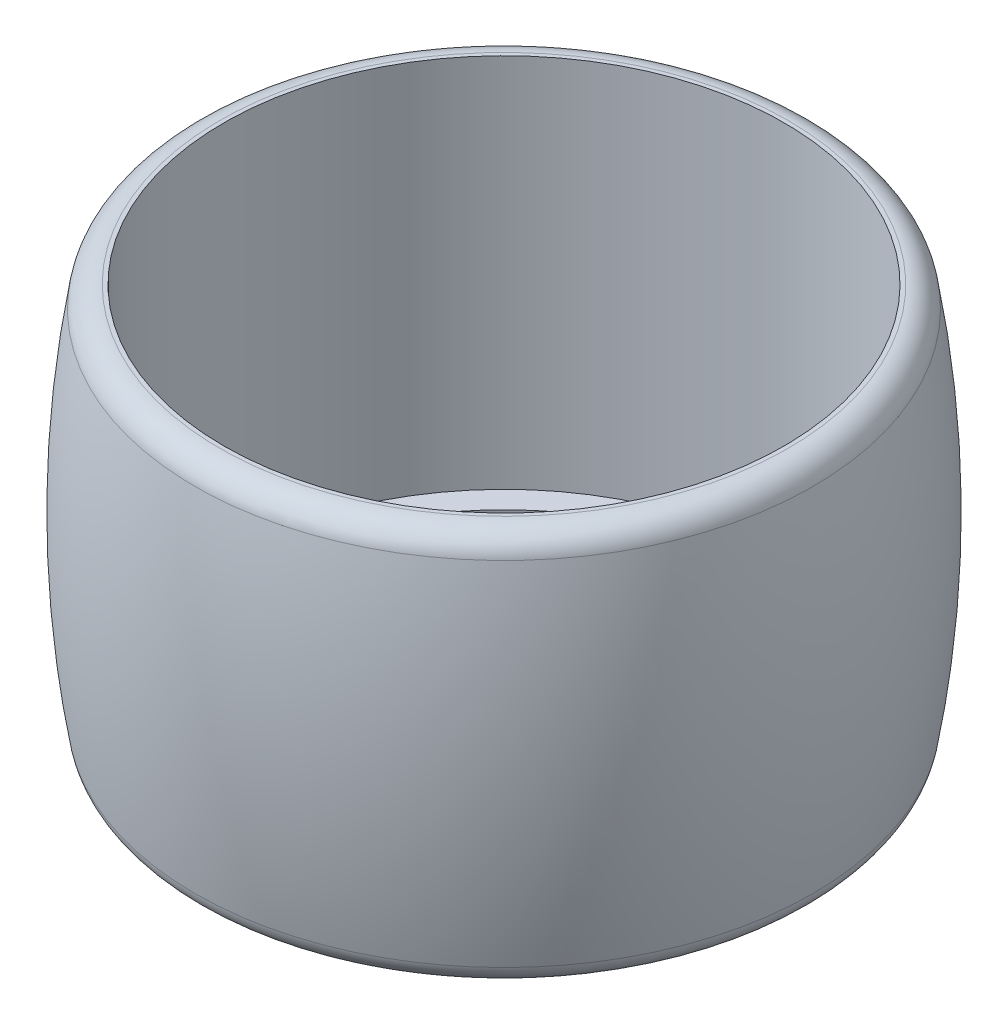
ISO-10303-21;
HEADER;
FILE_DESCRIPTION(('STEP AP214'),'2;1');
FILE_NAME('part.step','',(''),(''),'','','');
FILE_SCHEMA(('AUTOMOTIVE_DESIGN { 1 0 10303 214 1 1 1 1 }'));
ENDSEC;
DATA;
#1=APPLICATION_CONTEXT('core data for automotive mechanical design processes');
#2=APPLICATION_PROTOCOL_DEFINITION('international standard','automotive_design',2000,#1);
#3=PRODUCT_CONTEXT('',#1,'mechanical');
#4=PRODUCT('Part','Part','',(#3));
#5=PRODUCT_RELATED_PRODUCT_CATEGORY('part','',(#4));
#6=PRODUCT_DEFINITION_FORMATION('','',#4);
#7=PRODUCT_DEFINITION_CONTEXT('part definition',#1,'design');
#8=PRODUCT_DEFINITION('design','',#6,#7);
#9=PRODUCT_DEFINITION_SHAPE('','',#8);
#10=(LENGTH_UNIT() NAMED_UNIT(*) SI_UNIT(.MILLI.,.METRE.));
#11=(NAMED_UNIT(*) PLANE_ANGLE_UNIT() SI_UNIT($,.RADIAN.));
#12=(NAMED_UNIT(*) SI_UNIT($,.STERADIAN.) SOLID_ANGLE_UNIT());
#13=UNCERTAINTY_MEASURE_WITH_UNIT(LENGTH_MEASURE(1.E-05),#10,'distance_accuracy_value','');
#14=(GEOMETRIC_REPRESENTATION_CONTEXT(3) GLOBAL_UNCERTAINTY_ASSIGNED_CONTEXT((#13)) GLOBAL_UNIT_ASSIGNED_CONTEXT((#10,
#11,#12)) REPRESENTATION_CONTEXT('',''));
#15=CARTESIAN_POINT('',(0.,0.,0.));
#16=DIRECTION('',(0.,0.,1.));
#17=DIRECTION('',(1.,0.,0.));
#18=AXIS2_PLACEMENT_3D('',#15,#16,#17);
#19=CARTESIAN_POINT('',(0.,7.38603036951855,0.));
#20=DIRECTION('',(0.,1.,0.));
#21=DIRECTION('',(0.,0.,1.));
#22=AXIS2_PLACEMENT_3D('',#19,#20,#21);
#23=CYLINDRICAL_SURFACE('',#22,20.45);
#24=CARTESIAN_POINT('',(0.,-15.8,0.));
#25=DIRECTION('',(0.,1.,0.));
#26=DIRECTION('',(0.,0.,1.));
#27=AXIS2_PLACEMENT_3D('',#24,#25,#26);
#28=CIRCLE('',#27,20.45);
#29=CARTESIAN_POINT('',(0.,-15.8,20.45));
#30=VERTEX_POINT('',#29);
#31=EDGE_CURVE('E79',#30,#30,#28,.T.);
#32=ORIENTED_EDGE('',*,*,#31,.F.);
#33=EDGE_LOOP('',(#32));
#34=FACE_BOUND('',#33,.T.);
#35=CARTESIAN_POINT('',(0.,-14.3,0.));
#36=DIRECTION('',(0.,1.,0.));
#37=DIRECTION('',(0.,0.,1.));
#38=AXIS2_PLACEMENT_3D('',#35,#36,#37);
#39=CIRCLE('',#38,20.45);
#40=CARTESIAN_POINT('',(0.,-14.3,20.45));
#41=VERTEX_POINT('',#40);
#42=EDGE_CURVE('E67',#41,#41,#39,.T.);
#43=ORIENTED_EDGE('',*,*,#42,.T.);
#44=EDGE_LOOP('',(#43));
#45=FACE_BOUND('',#44,.T.);
#46=ADVANCED_FACE('F43',(#34,#45),#23,.F.);
#47=CARTESIAN_POINT('',(20.45,-14.3,0.));
#48=DIRECTION('',(0.,-1.,0.));
#49=DIRECTION('',(0.,0.,-1.));
#50=AXIS2_PLACEMENT_3D('',#47,#48,#49);
#51=PLANE('',#50);
#52=ORIENTED_EDGE('',*,*,#42,.F.);
#53=EDGE_LOOP('',(#52));
#54=FACE_BOUND('',#53,.T.);
#55=CARTESIAN_POINT('',(0.,-14.3,0.));
#56=DIRECTION('',(0.,1.,0.));
#57=DIRECTION('',(0.,0.,1.));
#58=AXIS2_PLACEMENT_3D('',#55,#56,#57);
#59=CIRCLE('',#58,22.45);
#60=CARTESIAN_POINT('',(0.,-14.3,22.45));
#61=VERTEX_POINT('',#60);
#62=EDGE_CURVE('E71',#61,#61,#59,.T.);
#63=ORIENTED_EDGE('',*,*,#62,.T.);
#64=EDGE_LOOP('',(#63));
#65=FACE_BOUND('',#64,.T.);
#66=ADVANCED_FACE('F88',(#54,#65),#51,.F.);
#67=CARTESIAN_POINT('',(0.,7.38603036951855,0.));
#68=DIRECTION('',(0.,1.,0.));
#69=DIRECTION('',(0.,0.,1.));
#70=AXIS2_PLACEMENT_3D('',#67,#68,#69);
#71=CYLINDRICAL_SURFACE('',#70,22.45);
#72=ORIENTED_EDGE('',*,*,#62,.F.);
#73=EDGE_LOOP('',(#72));
#74=FACE_BOUND('',#73,.T.);
#75=CARTESIAN_POINT('',(0.,15.8,0.));
#76=DIRECTION('',(0.,1.,0.));
#77=DIRECTION('',(0.,0.,1.));
#78=AXIS2_PLACEMENT_3D('',#75,#76,#77);
#79=CIRCLE('',#78,22.45);
#80=CARTESIAN_POINT('',(0.,15.8,22.45));
#81=VERTEX_POINT('',#80);
#82=EDGE_CURVE('E75',#81,#81,#79,.T.);
#83=ORIENTED_EDGE('',*,*,#82,.T.);
#84=EDGE_LOOP('',(#83));
#85=FACE_BOUND('',#84,.T.);
#86=ADVANCED_FACE('F94',(#74,#85),#71,.F.);
#87=CARTESIAN_POINT('',(22.45,15.8,0.));
#88=DIRECTION('',(0.,-1.,0.));
#89=DIRECTION('',(0.,0.,-1.));
#90=AXIS2_PLACEMENT_3D('',#87,#88,#89);
#91=PLANE('',#90);
#92=CARTESIAN_POINT('',(0.,15.8,0.));
#93=DIRECTION('',(0.,-1.,0.));
#94=DIRECTION('',(0.,0.,-1.));
#95=AXIS2_PLACEMENT_3D('',#92,#93,#94);
#96=CIRCLE('',#95,22.7728289553131);
#97=CARTESIAN_POINT('',(0.,15.8,-22.7728289553131));
#98=VERTEX_POINT('',#97);
#99=EDGE_CURVE('E10',#98,#98,#96,.F.);
#100=ORIENTED_EDGE('',*,*,#99,.T.);
#101=EDGE_LOOP('',(#100));
#102=FACE_BOUND('',#101,.T.);
#103=ORIENTED_EDGE('',*,*,#82,.F.);
#104=EDGE_LOOP('',(#103));
#105=FACE_BOUND('',#104,.T.);
#106=ADVANCED_FACE('F100',(#102,#105),#91,.F.);
#107=CARTESIAN_POINT('',(0.,0.,0.));
#108=DIRECTION('',(0.,1.,0.));
#109=DIRECTION('',(0.,0.,1.));
#110=AXIS2_PLACEMENT_3D('',#107,#108,#109);
#111=DEGENERATE_TOROIDAL_SURFACE('',#110,60.,85.9153216836205,.F.);
#112=CARTESIAN_POINT('',(0.,-14.1289029875147,0.));
#113=DIRECTION('',(0.,1.,0.));
#114=DIRECTION('',(0.,0.,1.));
#115=AXIS2_PLACEMENT_3D('',#112,#113,#114);
#116=CIRCLE('',#115,24.7455992979541);
#117=CARTESIAN_POINT('',(0.,-14.1289029875147,24.7455992979541));
#118=VERTEX_POINT('',#117);
#119=EDGE_CURVE('E56',#118,#118,#116,.T.);
#120=ORIENTED_EDGE('',*,*,#119,.T.);
#121=EDGE_LOOP('',(#120));
#122=FACE_BOUND('',#121,.T.);
#123=CARTESIAN_POINT('',(0.,14.1289029875147,0.));
#124=DIRECTION('',(0.,-1.,0.));
#125=DIRECTION('',(0.,0.,-1.));
#126=AXIS2_PLACEMENT_3D('',#123,#124,#125);
#127=CIRCLE('',#126,24.7455992979541);
#128=CARTESIAN_POINT('',(0.,14.1289029875147,-24.7455992979541));
#129=VERTEX_POINT('',#128);
#130=EDGE_CURVE('E61',#129,#129,#127,.T.);
#131=ORIENTED_EDGE('',*,*,#130,.T.);
#132=EDGE_LOOP('',(#131));
#133=FACE_BOUND('',#132,.T.);
#134=ADVANCED_FACE('F105',(#122,#133),#111,.F.);
#135=CARTESIAN_POINT('',(24.45,-15.8,0.));
#136=DIRECTION('',(0.,1.,0.));
#137=DIRECTION('',(0.,0.,1.));
#138=AXIS2_PLACEMENT_3D('',#135,#136,#137);
#139=PLANE('',#138);
#140=CARTESIAN_POINT('',(0.,-15.8,0.));
#141=DIRECTION('',(0.,1.,0.));
#142=DIRECTION('',(0.,0.,1.));
#143=AXIS2_PLACEMENT_3D('',#140,#141,#142);
#144=CIRCLE('',#143,22.7728289553131);
#145=CARTESIAN_POINT('',(0.,-15.8,22.7728289553131));
#146=VERTEX_POINT('',#145);
#147=EDGE_CURVE('E51',#146,#146,#144,.F.);
#148=ORIENTED_EDGE('',*,*,#147,.T.);
#149=EDGE_LOOP('',(#148));
#150=FACE_BOUND('',#149,.T.);
#151=ORIENTED_EDGE('',*,*,#31,.T.);
#152=EDGE_LOOP('',(#151));
#153=FACE_BOUND('',#152,.T.);
#154=ADVANCED_FACE('F84',(#150,#153),#139,.F.);
#155=CARTESIAN_POINT('',(0.,-13.8,0.));
#156=DIRECTION('',(0.,1.,0.));
#157=DIRECTION('',(0.,0.,1.));
#158=AXIS2_PLACEMENT_3D('',#155,#156,#157);
#159=TOROIDAL_SURFACE('',#158,22.7728289553131,2.);
#160=ORIENTED_EDGE('',*,*,#147,.F.);
#161=EDGE_LOOP('',(#160));
#162=FACE_BOUND('',#161,.T.);
#163=ORIENTED_EDGE('',*,*,#119,.F.);
#164=EDGE_LOOP('',(#163));
#165=FACE_BOUND('',#164,.T.);
#166=ADVANCED_FACE('F113',(#162,#165),#159,.T.);
#167=CARTESIAN_POINT('',(0.,13.8,0.));
#168=DIRECTION('',(0.,-1.,0.));
#169=DIRECTION('',(0.,0.,-1.));
#170=AXIS2_PLACEMENT_3D('',#167,#168,#169);
#171=TOROIDAL_SURFACE('',#170,22.7728289553131,2.);
#172=ORIENTED_EDGE('',*,*,#130,.F.);
#173=EDGE_LOOP('',(#172));
#174=FACE_BOUND('',#173,.T.);
#175=ORIENTED_EDGE('',*,*,#99,.F.);
#176=EDGE_LOOP('',(#175));
#177=FACE_BOUND('',#176,.T.);
#178=ADVANCED_FACE('F45',(#174,#177),#171,.T.);
#179=CLOSED_SHELL('',(#46,#66,#86,#106,#134,#154,#166,#178));
#180=MANIFOLD_SOLID_BREP('B2',#179);
#181=ADVANCED_BREP_SHAPE_REPRESENTATION('',(#18,#180),#14);
#182=SHAPE_DEFINITION_REPRESENTATION(#9,#181);
ENDSEC;
END-ISO-10303-21;
